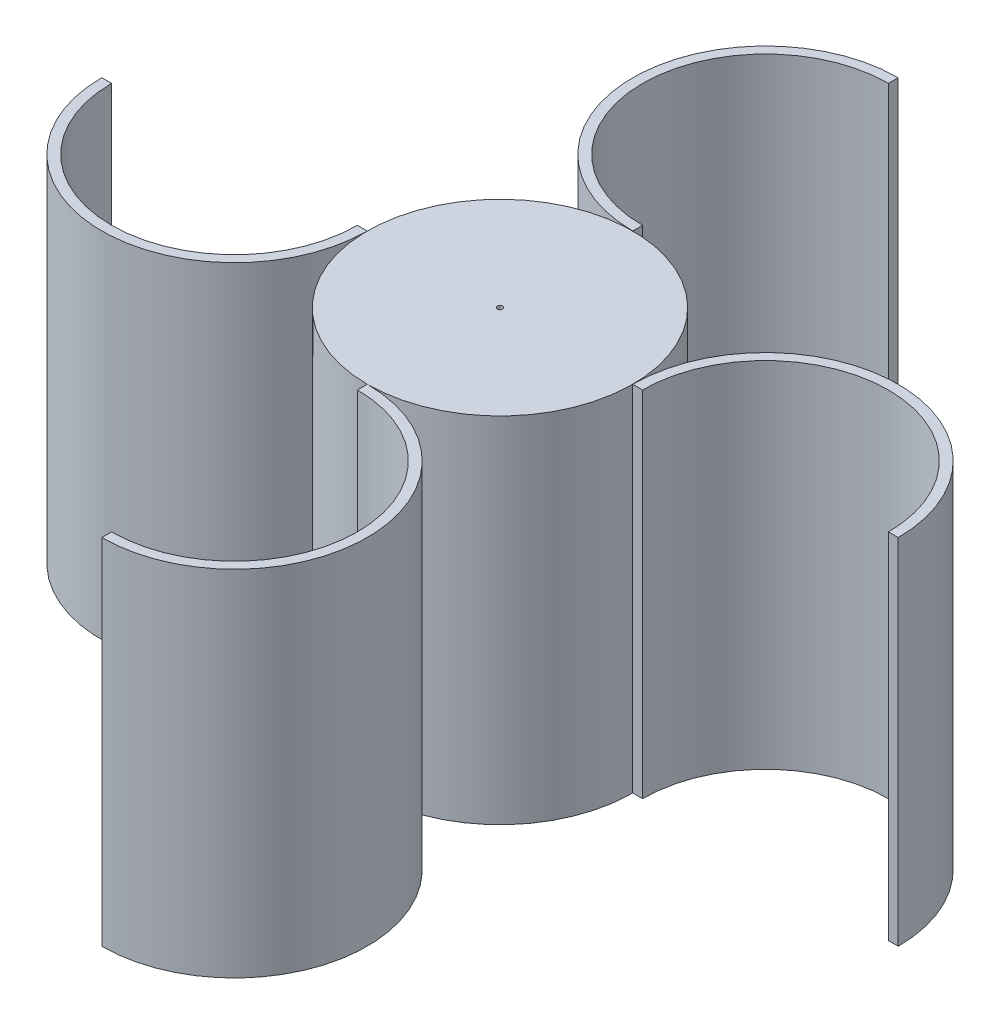
ISO-10303-21;
HEADER;
FILE_DESCRIPTION(('STEP AP214'),'2;1');
FILE_NAME('part.step','',(''),(''),'','','');
FILE_SCHEMA(('AUTOMOTIVE_DESIGN { 1 0 10303 214 1 1 1 1 }'));
ENDSEC;
DATA;
#1=APPLICATION_CONTEXT('core data for automotive mechanical design processes');
#2=APPLICATION_PROTOCOL_DEFINITION('international standard','automotive_design',2000,#1);
#3=PRODUCT_CONTEXT('',#1,'mechanical');
#4=PRODUCT('Part','Part','',(#3));
#5=PRODUCT_RELATED_PRODUCT_CATEGORY('part','',(#4));
#6=PRODUCT_DEFINITION_FORMATION('','',#4);
#7=PRODUCT_DEFINITION_CONTEXT('part definition',#1,'design');
#8=PRODUCT_DEFINITION('design','',#6,#7);
#9=PRODUCT_DEFINITION_SHAPE('','',#8);
#10=(LENGTH_UNIT() NAMED_UNIT(*) SI_UNIT(.MILLI.,.METRE.));
#11=(NAMED_UNIT(*) PLANE_ANGLE_UNIT() SI_UNIT($,.RADIAN.));
#12=(NAMED_UNIT(*) SI_UNIT($,.STERADIAN.) SOLID_ANGLE_UNIT());
#13=UNCERTAINTY_MEASURE_WITH_UNIT(LENGTH_MEASURE(1.E-05),#10,'distance_accuracy_value','');
#14=(GEOMETRIC_REPRESENTATION_CONTEXT(3) GLOBAL_UNCERTAINTY_ASSIGNED_CONTEXT((#13)) GLOBAL_UNIT_ASSIGNED_CONTEXT((#10,
#11,#12)) REPRESENTATION_CONTEXT('',''));
#15=CARTESIAN_POINT('',(0.,0.,0.));
#16=DIRECTION('',(0.,0.,1.));
#17=DIRECTION('',(1.,0.,0.));
#18=AXIS2_PLACEMENT_3D('',#15,#16,#17);
#19=CARTESIAN_POINT('',(15.,0.,0.));
#20=DIRECTION('',(0.,1.,0.));
#21=DIRECTION('',(0.,0.,1.));
#22=AXIS2_PLACEMENT_3D('',#19,#20,#21);
#23=CYLINDRICAL_SURFACE('',#22,6.94582088416006);
#24=CARTESIAN_POINT('',(15.,20.,0.));
#25=DIRECTION('',(0.,1.,0.));
#26=DIRECTION('',(0.,0.,1.));
#27=AXIS2_PLACEMENT_3D('',#24,#25,#26);
#28=CIRCLE('',#27,6.94582088416006);
#29=CARTESIAN_POINT('',(21.9458208841601,20.,0.));
#30=VERTEX_POINT('',#29);
#31=CARTESIAN_POINT('',(8.05417911583994,20.,0.));
#32=VERTEX_POINT('',#31);
#33=EDGE_CURVE('E13',#30,#32,#28,.T.);
#34=ORIENTED_EDGE('',*,*,#33,.T.);
#35=DIRECTION('',(0.,1.,0.));
#36=VECTOR('',#35,1.);
#37=CARTESIAN_POINT('',(8.05417911583994,0.,0.));
#38=LINE('',#37,#36);
#39=CARTESIAN_POINT('',(8.05417911583994,0.,0.));
#40=VERTEX_POINT('',#39);
#41=EDGE_CURVE('E135',#40,#32,#38,.T.);
#42=ORIENTED_EDGE('',*,*,#41,.F.);
#43=CARTESIAN_POINT('',(15.,0.,0.));
#44=DIRECTION('',(0.,1.,0.));
#45=DIRECTION('',(0.,0.,1.));
#46=AXIS2_PLACEMENT_3D('',#43,#44,#45);
#47=CIRCLE('',#46,6.94582088416006);
#48=CARTESIAN_POINT('',(21.9458208841601,0.,0.));
#49=VERTEX_POINT('',#48);
#50=EDGE_CURVE('E77',#49,#40,#47,.T.);
#51=ORIENTED_EDGE('',*,*,#50,.F.);
#52=DIRECTION('',(0.,1.,0.));
#53=VECTOR('',#52,1.);
#54=CARTESIAN_POINT('',(21.9458208841601,0.,0.));
#55=LINE('',#54,#53);
#56=EDGE_CURVE('E144',#49,#30,#55,.T.);
#57=ORIENTED_EDGE('',*,*,#56,.T.);
#58=EDGE_LOOP('',(#34,#42,#51,#57));
#59=FACE_BOUND('',#58,.T.);
#60=ADVANCED_FACE('F79',(#59),#23,.F.);
#61=CARTESIAN_POINT('',(0.,0.,0.));
#62=DIRECTION('',(0.,0.,-1.));
#63=DIRECTION('',(-1.,0.,0.));
#64=AXIS2_PLACEMENT_3D('',#61,#62,#63);
#65=PLANE('',#64);
#66=DIRECTION('',(-1.,0.,0.));
#67=VECTOR('',#66,1.);
#68=CARTESIAN_POINT('',(0.,20.,0.));
#69=LINE('',#68,#67);
#70=CARTESIAN_POINT('',(7.5,20.,0.));
#71=VERTEX_POINT('',#70);
#72=EDGE_CURVE('E123',#32,#71,#69,.T.);
#73=ORIENTED_EDGE('',*,*,#72,.T.);
#74=DIRECTION('',(0.,1.,0.));
#75=VECTOR('',#74,1.);
#76=CARTESIAN_POINT('',(7.5,0.,0.));
#77=LINE('',#76,#75);
#78=CARTESIAN_POINT('',(7.5,0.,0.));
#79=VERTEX_POINT('',#78);
#80=EDGE_CURVE('E126',#79,#71,#77,.T.);
#81=ORIENTED_EDGE('',*,*,#80,.F.);
#82=DIRECTION('',(-1.,0.,0.));
#83=VECTOR('',#82,1.);
#84=CARTESIAN_POINT('',(0.,0.,0.));
#85=LINE('',#84,#83);
#86=EDGE_CURVE('E141',#40,#79,#85,.T.);
#87=ORIENTED_EDGE('',*,*,#86,.F.);
#88=ORIENTED_EDGE('',*,*,#41,.T.);
#89=EDGE_LOOP('',(#73,#81,#87,#88));
#90=FACE_BOUND('',#89,.T.);
#91=ADVANCED_FACE('F132',(#90),#65,.F.);
#92=CARTESIAN_POINT('',(15.,0.,0.));
#93=DIRECTION('',(0.,1.,0.));
#94=DIRECTION('',(0.,0.,1.));
#95=AXIS2_PLACEMENT_3D('',#92,#93,#94);
#96=CYLINDRICAL_SURFACE('',#95,7.5);
#97=CARTESIAN_POINT('',(15.,20.,0.));
#98=DIRECTION('',(0.,1.,0.));
#99=DIRECTION('',(0.,0.,1.));
#100=AXIS2_PLACEMENT_3D('',#97,#98,#99);
#101=CIRCLE('',#100,7.5);
#102=CARTESIAN_POINT('',(22.5,20.,0.));
#103=VERTEX_POINT('',#102);
#104=EDGE_CURVE('E128',#103,#71,#101,.T.);
#105=ORIENTED_EDGE('',*,*,#104,.F.);
#106=DIRECTION('',(0.,1.,0.));
#107=VECTOR('',#106,1.);
#108=CARTESIAN_POINT('',(22.5,0.,0.));
#109=LINE('',#108,#107);
#110=CARTESIAN_POINT('',(22.5,0.,0.));
#111=VERTEX_POINT('',#110);
#112=EDGE_CURVE('E109',#111,#103,#109,.T.);
#113=ORIENTED_EDGE('',*,*,#112,.F.);
#114=CARTESIAN_POINT('',(15.,0.,0.));
#115=DIRECTION('',(0.,1.,0.));
#116=DIRECTION('',(0.,0.,1.));
#117=AXIS2_PLACEMENT_3D('',#114,#115,#116);
#118=CIRCLE('',#117,7.5);
#119=EDGE_CURVE('E134',#111,#79,#118,.T.);
#120=ORIENTED_EDGE('',*,*,#119,.T.);
#121=ORIENTED_EDGE('',*,*,#80,.T.);
#122=EDGE_LOOP('',(#105,#113,#120,#121));
#123=FACE_BOUND('',#122,.T.);
#124=ADVANCED_FACE('F129',(#123),#96,.T.);
#125=CARTESIAN_POINT('',(0.,0.,0.));
#126=DIRECTION('',(0.,0.,-1.));
#127=DIRECTION('',(-1.,0.,0.));
#128=AXIS2_PLACEMENT_3D('',#125,#126,#127);
#129=PLANE('',#128);
#130=DIRECTION('',(-1.,0.,0.));
#131=VECTOR('',#130,1.);
#132=CARTESIAN_POINT('',(0.,20.,0.));
#133=LINE('',#132,#131);
#134=EDGE_CURVE('E88',#103,#30,#133,.T.);
#135=ORIENTED_EDGE('',*,*,#134,.T.);
#136=ORIENTED_EDGE('',*,*,#56,.F.);
#137=DIRECTION('',(-1.,0.,0.));
#138=VECTOR('',#137,1.);
#139=CARTESIAN_POINT('',(0.,0.,0.));
#140=LINE('',#139,#138);
#141=EDGE_CURVE('E116',#111,#49,#140,.T.);
#142=ORIENTED_EDGE('',*,*,#141,.F.);
#143=ORIENTED_EDGE('',*,*,#112,.T.);
#144=EDGE_LOOP('',(#135,#136,#142,#143));
#145=FACE_BOUND('',#144,.T.);
#146=ADVANCED_FACE('F147',(#145),#129,.F.);
#147=CARTESIAN_POINT('',(0.,0.,0.));
#148=DIRECTION('',(0.,1.,0.));
#149=DIRECTION('',(0.,0.,1.));
#150=AXIS2_PLACEMENT_3D('',#147,#148,#149);
#151=PLANE('',#150);
#152=ORIENTED_EDGE('',*,*,#50,.T.);
#153=ORIENTED_EDGE('',*,*,#86,.T.);
#154=ORIENTED_EDGE('',*,*,#119,.F.);
#155=ORIENTED_EDGE('',*,*,#141,.T.);
#156=EDGE_LOOP('',(#152,#153,#154,#155));
#157=FACE_BOUND('',#156,.T.);
#158=ADVANCED_FACE('F80',(#157),#151,.F.);
#159=CARTESIAN_POINT('',(0.,20.,0.));
#160=DIRECTION('',(0.,1.,0.));
#161=DIRECTION('',(0.,0.,1.));
#162=AXIS2_PLACEMENT_3D('',#159,#160,#161);
#163=PLANE('',#162);
#164=ORIENTED_EDGE('',*,*,#33,.F.);
#165=ORIENTED_EDGE('',*,*,#134,.F.);
#166=ORIENTED_EDGE('',*,*,#104,.T.);
#167=ORIENTED_EDGE('',*,*,#72,.F.);
#168=EDGE_LOOP('',(#164,#165,#166,#167));
#169=FACE_BOUND('',#168,.T.);
#170=ADVANCED_FACE('F137',(#169),#163,.T.);
#171=CLOSED_SHELL('',(#60,#91,#124,#146,#158,#170));
#172=MANIFOLD_SOLID_BREP('B2',#171);
#173=CARTESIAN_POINT('',(-1.04744440165294E-13,0.,15.));
#174=DIRECTION('',(0.,1.,0.));
#175=DIRECTION('',(0.,0.,1.));
#176=AXIS2_PLACEMENT_3D('',#173,#174,#175);
#177=CYLINDRICAL_SURFACE('',#176,6.94582088416006);
#178=CARTESIAN_POINT('',(-1.04744440165294E-13,20.,15.));
#179=DIRECTION('',(0.,1.,0.));
#180=DIRECTION('',(0.,0.,1.));
#181=AXIS2_PLACEMENT_3D('',#178,#179,#180);
#182=CIRCLE('',#181,6.94582088416006);
#183=CARTESIAN_POINT('',(-1.53246848165277E-13,20.,21.9458208841601));
#184=VERTEX_POINT('',#183);
#185=CARTESIAN_POINT('',(0.,20.,8.05417911583994));
#186=VERTEX_POINT('',#185);
#187=EDGE_CURVE('E74',#184,#186,#182,.T.);
#188=ORIENTED_EDGE('',*,*,#187,.T.);
#189=DIRECTION('',(0.,1.,0.));
#190=VECTOR('',#189,1.);
#191=CARTESIAN_POINT('',(0.,0.,8.05417911583994));
#192=LINE('',#191,#190);
#193=CARTESIAN_POINT('',(0.,0.,8.05417911583994));
#194=VERTEX_POINT('',#193);
#195=EDGE_CURVE('E272',#194,#186,#192,.T.);
#196=ORIENTED_EDGE('',*,*,#195,.F.);
#197=CARTESIAN_POINT('',(-1.04744440165294E-13,0.,15.));
#198=DIRECTION('',(0.,1.,0.));
#199=DIRECTION('',(0.,0.,1.));
#200=AXIS2_PLACEMENT_3D('',#197,#198,#199);
#201=CIRCLE('',#200,6.94582088416006);
#202=CARTESIAN_POINT('',(-1.53246848165277E-13,0.,21.9458208841601));
#203=VERTEX_POINT('',#202);
#204=EDGE_CURVE('E219',#203,#194,#201,.T.);
#205=ORIENTED_EDGE('',*,*,#204,.F.);
#206=DIRECTION('',(0.,1.,0.));
#207=VECTOR('',#206,1.);
#208=CARTESIAN_POINT('',(-1.53246848165277E-13,0.,21.9458208841601));
#209=LINE('',#208,#207);
#210=EDGE_CURVE('E282',#203,#184,#209,.T.);
#211=ORIENTED_EDGE('',*,*,#210,.T.);
#212=EDGE_LOOP('',(#188,#196,#205,#211));
#213=FACE_BOUND('',#212,.T.);
#214=ADVANCED_FACE('F216',(#213),#177,.F.);
#215=CARTESIAN_POINT('',(0.,0.,0.));
#216=DIRECTION('',(1.,0.,0.));
#217=DIRECTION('',(0.,0.,-1.));
#218=AXIS2_PLACEMENT_3D('',#215,#216,#217);
#219=PLANE('',#218);
#220=DIRECTION('',(0.,0.,-1.));
#221=VECTOR('',#220,1.);
#222=CARTESIAN_POINT('',(0.,20.,0.));
#223=LINE('',#222,#221);
#224=CARTESIAN_POINT('',(0.,20.,7.5));
#225=VERTEX_POINT('',#224);
#226=EDGE_CURVE('E262',#186,#225,#223,.T.);
#227=ORIENTED_EDGE('',*,*,#226,.T.);
#228=DIRECTION('',(0.,1.,0.));
#229=VECTOR('',#228,1.);
#230=CARTESIAN_POINT('',(0.,0.,7.5));
#231=LINE('',#230,#229);
#232=CARTESIAN_POINT('',(0.,0.,7.5));
#233=VERTEX_POINT('',#232);
#234=EDGE_CURVE('E268',#233,#225,#231,.T.);
#235=ORIENTED_EDGE('',*,*,#234,.F.);
#236=DIRECTION('',(0.,0.,-1.));
#237=VECTOR('',#236,1.);
#238=CARTESIAN_POINT('',(0.,0.,0.));
#239=LINE('',#238,#237);
#240=EDGE_CURVE('E285',#194,#233,#239,.T.);
#241=ORIENTED_EDGE('',*,*,#240,.F.);
#242=ORIENTED_EDGE('',*,*,#195,.T.);
#243=EDGE_LOOP('',(#227,#235,#241,#242));
#244=FACE_BOUND('',#243,.T.);
#245=ADVANCED_FACE('F274',(#244),#219,.F.);
#246=CARTESIAN_POINT('',(-1.04744440165294E-13,0.,15.));
#247=DIRECTION('',(0.,1.,0.));
#248=DIRECTION('',(0.,0.,1.));
#249=AXIS2_PLACEMENT_3D('',#246,#247,#248);
#250=CYLINDRICAL_SURFACE('',#249,7.5);
#251=CARTESIAN_POINT('',(-1.04744440165294E-13,20.,15.));
#252=DIRECTION('',(0.,1.,0.));
#253=DIRECTION('',(0.,0.,1.));
#254=AXIS2_PLACEMENT_3D('',#251,#252,#253);
#255=CIRCLE('',#254,7.5);
#256=CARTESIAN_POINT('',(-1.57116660247941E-13,20.,22.5));
#257=VERTEX_POINT('',#256);
#258=EDGE_CURVE('E269',#257,#225,#255,.T.);
#259=ORIENTED_EDGE('',*,*,#258,.F.);
#260=DIRECTION('',(0.,1.,0.));
#261=VECTOR('',#260,1.);
#262=CARTESIAN_POINT('',(-1.57116660247941E-13,0.,22.5));
#263=LINE('',#262,#261);
#264=CARTESIAN_POINT('',(-1.57116660247941E-13,0.,22.5));
#265=VERTEX_POINT('',#264);
#266=EDGE_CURVE('E249',#265,#257,#263,.T.);
#267=ORIENTED_EDGE('',*,*,#266,.F.);
#268=CARTESIAN_POINT('',(-1.04744440165294E-13,0.,15.));
#269=DIRECTION('',(0.,1.,0.));
#270=DIRECTION('',(0.,0.,1.));
#271=AXIS2_PLACEMENT_3D('',#268,#269,#270);
#272=CIRCLE('',#271,7.5);
#273=EDGE_CURVE('E271',#265,#233,#272,.T.);
#274=ORIENTED_EDGE('',*,*,#273,.T.);
#275=ORIENTED_EDGE('',*,*,#234,.T.);
#276=EDGE_LOOP('',(#259,#267,#274,#275));
#277=FACE_BOUND('',#276,.T.);
#278=ADVANCED_FACE('F267',(#277),#250,.T.);
#279=CARTESIAN_POINT('',(0.,0.,0.));
#280=DIRECTION('',(1.,0.,0.));
#281=DIRECTION('',(0.,0.,-1.));
#282=AXIS2_PLACEMENT_3D('',#279,#280,#281);
#283=PLANE('',#282);
#284=DIRECTION('',(0.,0.,-1.));
#285=VECTOR('',#284,1.);
#286=CARTESIAN_POINT('',(0.,20.,0.));
#287=LINE('',#286,#285);
#288=EDGE_CURVE('E229',#257,#184,#287,.T.);
#289=ORIENTED_EDGE('',*,*,#288,.T.);
#290=ORIENTED_EDGE('',*,*,#210,.F.);
#291=DIRECTION('',(0.,0.,-1.));
#292=VECTOR('',#291,1.);
#293=CARTESIAN_POINT('',(0.,0.,0.));
#294=LINE('',#293,#292);
#295=EDGE_CURVE('E260',#265,#203,#294,.T.);
#296=ORIENTED_EDGE('',*,*,#295,.F.);
#297=ORIENTED_EDGE('',*,*,#266,.T.);
#298=EDGE_LOOP('',(#289,#290,#296,#297));
#299=FACE_BOUND('',#298,.T.);
#300=ADVANCED_FACE('F289',(#299),#283,.F.);
#301=CARTESIAN_POINT('',(0.,0.,0.));
#302=DIRECTION('',(0.,1.,0.));
#303=DIRECTION('',(0.,0.,1.));
#304=AXIS2_PLACEMENT_3D('',#301,#302,#303);
#305=PLANE('',#304);
#306=ORIENTED_EDGE('',*,*,#204,.T.);
#307=ORIENTED_EDGE('',*,*,#240,.T.);
#308=ORIENTED_EDGE('',*,*,#273,.F.);
#309=ORIENTED_EDGE('',*,*,#295,.T.);
#310=EDGE_LOOP('',(#306,#307,#308,#309));
#311=FACE_BOUND('',#310,.T.);
#312=ADVANCED_FACE('F217',(#311),#305,.F.);
#313=CARTESIAN_POINT('',(0.,20.,0.));
#314=DIRECTION('',(0.,1.,0.));
#315=DIRECTION('',(0.,0.,1.));
#316=AXIS2_PLACEMENT_3D('',#313,#314,#315);
#317=PLANE('',#316);
#318=ORIENTED_EDGE('',*,*,#187,.F.);
#319=ORIENTED_EDGE('',*,*,#288,.F.);
#320=ORIENTED_EDGE('',*,*,#258,.T.);
#321=ORIENTED_EDGE('',*,*,#226,.F.);
#322=EDGE_LOOP('',(#318,#319,#320,#321));
#323=FACE_BOUND('',#322,.T.);
#324=ADVANCED_FACE('F279',(#323),#317,.T.);
#325=CLOSED_SHELL('',(#214,#245,#278,#300,#312,#324));
#326=MANIFOLD_SOLID_BREP('B7',#325);
#327=CARTESIAN_POINT('',(0.,20.,0.));
#328=DIRECTION('',(0.,1.,0.));
#329=DIRECTION('',(0.,0.,1.));
#330=AXIS2_PLACEMENT_3D('',#327,#328,#329);
#331=PLANE('',#330);
#332=CARTESIAN_POINT('',(-15.,20.,-1.57116660247941E-13));
#333=DIRECTION('',(0.,1.,0.));
#334=DIRECTION('',(0.,0.,1.));
#335=AXIS2_PLACEMENT_3D('',#332,#333,#334);
#336=CIRCLE('',#335,6.94582088416006);
#337=CARTESIAN_POINT('',(-21.9458208841601,20.,-2.29870272247916E-13));
#338=VERTEX_POINT('',#337);
#339=CARTESIAN_POINT('',(-8.05417911583994,20.,0.));
#340=VERTEX_POINT('',#339);
#341=EDGE_CURVE('E212',#338,#340,#336,.T.);
#342=ORIENTED_EDGE('',*,*,#341,.F.);
#343=DIRECTION('',(1.,0.,0.));
#344=VECTOR('',#343,1.);
#345=CARTESIAN_POINT('',(0.,20.,0.));
#346=LINE('',#345,#344);
#347=CARTESIAN_POINT('',(-22.5,20.,-2.35674990371912E-13));
#348=VERTEX_POINT('',#347);
#349=EDGE_CURVE('E368',#348,#338,#346,.T.);
#350=ORIENTED_EDGE('',*,*,#349,.F.);
#351=CARTESIAN_POINT('',(-15.,20.,-1.57116660247941E-13));
#352=DIRECTION('',(0.,1.,0.));
#353=DIRECTION('',(0.,0.,1.));
#354=AXIS2_PLACEMENT_3D('',#351,#352,#353);
#355=CIRCLE('',#354,7.5);
#356=CARTESIAN_POINT('',(-7.5,20.,0.));
#357=VERTEX_POINT('',#356);
#358=EDGE_CURVE('E407',#348,#357,#355,.T.);
#359=ORIENTED_EDGE('',*,*,#358,.T.);
#360=DIRECTION('',(1.,0.,0.));
#361=VECTOR('',#360,1.);
#362=CARTESIAN_POINT('',(0.,20.,0.));
#363=LINE('',#362,#361);
#364=EDGE_CURVE('E404',#340,#357,#363,.T.);
#365=ORIENTED_EDGE('',*,*,#364,.F.);
#366=EDGE_LOOP('',(#342,#350,#359,#365));
#367=FACE_BOUND('',#366,.T.);
#368=ADVANCED_FACE('F356',(#367),#331,.T.);
#369=CARTESIAN_POINT('',(0.,0.,0.));
#370=DIRECTION('',(0.,0.,1.));
#371=DIRECTION('',(1.,0.,0.));
#372=AXIS2_PLACEMENT_3D('',#369,#370,#371);
#373=PLANE('',#372);
#374=ORIENTED_EDGE('',*,*,#364,.T.);
#375=DIRECTION('',(0.,1.,0.));
#376=VECTOR('',#375,1.);
#377=CARTESIAN_POINT('',(-7.5,0.,0.));
#378=LINE('',#377,#376);
#379=CARTESIAN_POINT('',(-7.5,0.,0.));
#380=VERTEX_POINT('',#379);
#381=EDGE_CURVE('E410',#380,#357,#378,.T.);
#382=ORIENTED_EDGE('',*,*,#381,.F.);
#383=DIRECTION('',(1.,0.,0.));
#384=VECTOR('',#383,1.);
#385=CARTESIAN_POINT('',(0.,0.,0.));
#386=LINE('',#385,#384);
#387=CARTESIAN_POINT('',(-8.05417911583994,0.,0.));
#388=VERTEX_POINT('',#387);
#389=EDGE_CURVE('E425',#388,#380,#386,.T.);
#390=ORIENTED_EDGE('',*,*,#389,.F.);
#391=DIRECTION('',(0.,1.,0.));
#392=VECTOR('',#391,1.);
#393=CARTESIAN_POINT('',(-8.05417911583994,0.,0.));
#394=LINE('',#393,#392);
#395=EDGE_CURVE('E412',#388,#340,#394,.T.);
#396=ORIENTED_EDGE('',*,*,#395,.T.);
#397=EDGE_LOOP('',(#374,#382,#390,#396));
#398=FACE_BOUND('',#397,.T.);
#399=ADVANCED_FACE('F414',(#398),#373,.F.);
#400=CARTESIAN_POINT('',(-15.,0.,-1.57116660247941E-13));
#401=DIRECTION('',(0.,1.,0.));
#402=DIRECTION('',(0.,0.,1.));
#403=AXIS2_PLACEMENT_3D('',#400,#401,#402);
#404=CYLINDRICAL_SURFACE('',#403,7.5);
#405=ORIENTED_EDGE('',*,*,#358,.F.);
#406=DIRECTION('',(0.,1.,0.));
#407=VECTOR('',#406,1.);
#408=CARTESIAN_POINT('',(-22.5,0.,-2.35674990371912E-13));
#409=LINE('',#408,#407);
#410=CARTESIAN_POINT('',(-22.5,0.,-2.35674990371912E-13));
#411=VERTEX_POINT('',#410);
#412=EDGE_CURVE('E388',#411,#348,#409,.T.);
#413=ORIENTED_EDGE('',*,*,#412,.F.);
#414=CARTESIAN_POINT('',(-15.,0.,-1.57116660247941E-13));
#415=DIRECTION('',(0.,1.,0.));
#416=DIRECTION('',(0.,0.,1.));
#417=AXIS2_PLACEMENT_3D('',#414,#415,#416);
#418=CIRCLE('',#417,7.5);
#419=EDGE_CURVE('E411',#411,#380,#418,.T.);
#420=ORIENTED_EDGE('',*,*,#419,.T.);
#421=ORIENTED_EDGE('',*,*,#381,.T.);
#422=EDGE_LOOP('',(#405,#413,#420,#421));
#423=FACE_BOUND('',#422,.T.);
#424=ADVANCED_FACE('F408',(#423),#404,.T.);
#425=CARTESIAN_POINT('',(0.,0.,0.));
#426=DIRECTION('',(0.,0.,1.));
#427=DIRECTION('',(1.,0.,0.));
#428=AXIS2_PLACEMENT_3D('',#425,#426,#427);
#429=PLANE('',#428);
#430=ORIENTED_EDGE('',*,*,#349,.T.);
#431=DIRECTION('',(0.,1.,0.));
#432=VECTOR('',#431,1.);
#433=CARTESIAN_POINT('',(-21.9458208841601,0.,-2.29870272247916E-13));
#434=LINE('',#433,#432);
#435=CARTESIAN_POINT('',(-21.9458208841601,0.,-2.29870272247916E-13));
#436=VERTEX_POINT('',#435);
#437=EDGE_CURVE('E424',#436,#338,#434,.T.);
#438=ORIENTED_EDGE('',*,*,#437,.F.);
#439=DIRECTION('',(1.,0.,0.));
#440=VECTOR('',#439,1.);
#441=CARTESIAN_POINT('',(0.,0.,0.));
#442=LINE('',#441,#440);
#443=EDGE_CURVE('E400',#411,#436,#442,.T.);
#444=ORIENTED_EDGE('',*,*,#443,.F.);
#445=ORIENTED_EDGE('',*,*,#412,.T.);
#446=EDGE_LOOP('',(#430,#438,#444,#445));
#447=FACE_BOUND('',#446,.T.);
#448=ADVANCED_FACE('F429',(#447),#429,.F.);
#449=CARTESIAN_POINT('',(-15.,0.,-1.57116660247941E-13));
#450=DIRECTION('',(0.,1.,0.));
#451=DIRECTION('',(0.,0.,1.));
#452=AXIS2_PLACEMENT_3D('',#449,#450,#451);
#453=CYLINDRICAL_SURFACE('',#452,6.94582088416006);
#454=ORIENTED_EDGE('',*,*,#341,.T.);
#455=ORIENTED_EDGE('',*,*,#395,.F.);
#456=CARTESIAN_POINT('',(-15.,0.,-1.57116660247941E-13));
#457=DIRECTION('',(0.,1.,0.));
#458=DIRECTION('',(0.,0.,1.));
#459=AXIS2_PLACEMENT_3D('',#456,#457,#458);
#460=CIRCLE('',#459,6.94582088416006);
#461=EDGE_CURVE('E359',#436,#388,#460,.T.);
#462=ORIENTED_EDGE('',*,*,#461,.F.);
#463=ORIENTED_EDGE('',*,*,#437,.T.);
#464=EDGE_LOOP('',(#454,#455,#462,#463));
#465=FACE_BOUND('',#464,.T.);
#466=ADVANCED_FACE('F430',(#465),#453,.F.);
#467=CARTESIAN_POINT('',(0.,0.,0.));
#468=DIRECTION('',(0.,1.,0.));
#469=DIRECTION('',(0.,0.,1.));
#470=AXIS2_PLACEMENT_3D('',#467,#468,#469);
#471=PLANE('',#470);
#472=ORIENTED_EDGE('',*,*,#461,.T.);
#473=ORIENTED_EDGE('',*,*,#389,.T.);
#474=ORIENTED_EDGE('',*,*,#419,.F.);
#475=ORIENTED_EDGE('',*,*,#443,.T.);
#476=EDGE_LOOP('',(#472,#473,#474,#475));
#477=FACE_BOUND('',#476,.T.);
#478=ADVANCED_FACE('F357',(#477),#471,.F.);
#479=CLOSED_SHELL('',(#368,#399,#424,#448,#466,#478));
#480=MANIFOLD_SOLID_BREP('B67',#479);
#481=CARTESIAN_POINT('',(0.,0.,-15.));
#482=DIRECTION('',(0.,1.,0.));
#483=DIRECTION('',(0.,0.,1.));
#484=AXIS2_PLACEMENT_3D('',#481,#482,#483);
#485=CYLINDRICAL_SURFACE('',#484,6.94582088416006);
#486=CARTESIAN_POINT('',(0.,20.,-15.));
#487=DIRECTION('',(0.,1.,0.));
#488=DIRECTION('',(0.,0.,1.));
#489=AXIS2_PLACEMENT_3D('',#486,#487,#488);
#490=CIRCLE('',#489,6.94582088416006);
#491=CARTESIAN_POINT('',(0.,20.,-21.9458208841601));
#492=VERTEX_POINT('',#491);
#493=CARTESIAN_POINT('',(0.,20.,-8.05417911583994));
#494=VERTEX_POINT('',#493);
#495=EDGE_CURVE('E572',#492,#494,#490,.T.);
#496=ORIENTED_EDGE('',*,*,#495,.T.);
#497=DIRECTION('',(0.,1.,0.));
#498=VECTOR('',#497,1.);
#499=CARTESIAN_POINT('',(0.,0.,-8.05417911583994));
#500=LINE('',#499,#498);
#501=CARTESIAN_POINT('',(0.,0.,-8.05417911583994));
#502=VERTEX_POINT('',#501);
#503=EDGE_CURVE('E353',#502,#494,#500,.T.);
#504=ORIENTED_EDGE('',*,*,#503,.F.);
#505=CARTESIAN_POINT('',(0.,0.,-15.));
#506=DIRECTION('',(0.,1.,0.));
#507=DIRECTION('',(0.,0.,1.));
#508=AXIS2_PLACEMENT_3D('',#505,#506,#507);
#509=CIRCLE('',#508,6.94582088416006);
#510=CARTESIAN_POINT('',(0.,0.,-21.9458208841601));
#511=VERTEX_POINT('',#510);
#512=EDGE_CURVE('E566',#511,#502,#509,.T.);
#513=ORIENTED_EDGE('',*,*,#512,.F.);
#514=DIRECTION('',(0.,1.,0.));
#515=VECTOR('',#514,1.);
#516=CARTESIAN_POINT('',(0.,0.,-21.9458208841601));
#517=LINE('',#516,#515);
#518=EDGE_CURVE('E514',#511,#492,#517,.T.);
#519=ORIENTED_EDGE('',*,*,#518,.T.);
#520=EDGE_LOOP('',(#496,#504,#513,#519));
#521=FACE_BOUND('',#520,.T.);
#522=ADVANCED_FACE('F512',(#521),#485,.F.);
#523=CARTESIAN_POINT('',(0.,0.,0.));
#524=DIRECTION('',(-1.,0.,0.));
#525=DIRECTION('',(0.,0.,1.));
#526=AXIS2_PLACEMENT_3D('',#523,#524,#525);
#527=PLANE('',#526);
#528=DIRECTION('',(0.,0.,1.));
#529=VECTOR('',#528,1.);
#530=CARTESIAN_POINT('',(0.,20.,0.));
#531=LINE('',#530,#529);
#532=CARTESIAN_POINT('',(0.,20.,-7.5));
#533=VERTEX_POINT('',#532);
#534=EDGE_CURVE('E549',#494,#533,#531,.T.);
#535=ORIENTED_EDGE('',*,*,#534,.T.);
#536=DIRECTION('',(0.,1.,0.));
#537=VECTOR('',#536,1.);
#538=CARTESIAN_POINT('',(0.,0.,-7.5));
#539=LINE('',#538,#537);
#540=CARTESIAN_POINT('',(0.,0.,-7.5));
#541=VERTEX_POINT('',#540);
#542=EDGE_CURVE('E517',#541,#533,#539,.T.);
#543=ORIENTED_EDGE('',*,*,#542,.F.);
#544=DIRECTION('',(0.,0.,1.));
#545=VECTOR('',#544,1.);
#546=CARTESIAN_POINT('',(0.,0.,0.));
#547=LINE('',#546,#545);
#548=EDGE_CURVE('E526',#502,#541,#547,.T.);
#549=ORIENTED_EDGE('',*,*,#548,.F.);
#550=ORIENTED_EDGE('',*,*,#503,.T.);
#551=EDGE_LOOP('',(#535,#543,#549,#550));
#552=FACE_BOUND('',#551,.T.);
#553=ADVANCED_FACE('F585',(#552),#527,.F.);
#554=CARTESIAN_POINT('',(0.,0.,-15.));
#555=DIRECTION('',(0.,1.,0.));
#556=DIRECTION('',(0.,0.,1.));
#557=AXIS2_PLACEMENT_3D('',#554,#555,#556);
#558=CYLINDRICAL_SURFACE('',#557,7.5);
#559=CARTESIAN_POINT('',(0.,20.,-15.));
#560=DIRECTION('',(0.,1.,0.));
#561=DIRECTION('',(0.,0.,1.));
#562=AXIS2_PLACEMENT_3D('',#559,#560,#561);
#563=CIRCLE('',#562,7.5);
#564=CARTESIAN_POINT('',(0.,20.,-22.5));
#565=VERTEX_POINT('',#564);
#566=EDGE_CURVE('E565',#565,#533,#563,.T.);
#567=ORIENTED_EDGE('',*,*,#566,.F.);
#568=DIRECTION('',(0.,1.,0.));
#569=VECTOR('',#568,1.);
#570=CARTESIAN_POINT('',(0.,0.,-22.5));
#571=LINE('',#570,#569);
#572=CARTESIAN_POINT('',(0.,0.,-22.5));
#573=VERTEX_POINT('',#572);
#574=EDGE_CURVE('E558',#573,#565,#571,.T.);
#575=ORIENTED_EDGE('',*,*,#574,.F.);
#576=CARTESIAN_POINT('',(0.,0.,-15.));
#577=DIRECTION('',(0.,1.,0.));
#578=DIRECTION('',(0.,0.,1.));
#579=AXIS2_PLACEMENT_3D('',#576,#577,#578);
#580=CIRCLE('',#579,7.5);
#581=EDGE_CURVE('E561',#573,#541,#580,.T.);
#582=ORIENTED_EDGE('',*,*,#581,.T.);
#583=ORIENTED_EDGE('',*,*,#542,.T.);
#584=EDGE_LOOP('',(#567,#575,#582,#583));
#585=FACE_BOUND('',#584,.T.);
#586=ADVANCED_FACE('F557',(#585),#558,.T.);
#587=CARTESIAN_POINT('',(0.,0.,0.));
#588=DIRECTION('',(-1.,0.,0.));
#589=DIRECTION('',(0.,0.,1.));
#590=AXIS2_PLACEMENT_3D('',#587,#588,#589);
#591=PLANE('',#590);
#592=DIRECTION('',(0.,0.,1.));
#593=VECTOR('',#592,1.);
#594=CARTESIAN_POINT('',(0.,20.,0.));
#595=LINE('',#594,#593);
#596=EDGE_CURVE('E577',#565,#492,#595,.T.);
#597=ORIENTED_EDGE('',*,*,#596,.T.);
#598=ORIENTED_EDGE('',*,*,#518,.F.);
#599=DIRECTION('',(0.,0.,1.));
#600=VECTOR('',#599,1.);
#601=CARTESIAN_POINT('',(0.,0.,0.));
#602=LINE('',#601,#600);
#603=EDGE_CURVE('E559',#573,#511,#602,.T.);
#604=ORIENTED_EDGE('',*,*,#603,.F.);
#605=ORIENTED_EDGE('',*,*,#574,.T.);
#606=EDGE_LOOP('',(#597,#598,#604,#605));
#607=FACE_BOUND('',#606,.T.);
#608=ADVANCED_FACE('F564',(#607),#591,.F.);
#609=CARTESIAN_POINT('',(0.,0.,0.));
#610=DIRECTION('',(0.,1.,0.));
#611=DIRECTION('',(0.,0.,1.));
#612=AXIS2_PLACEMENT_3D('',#609,#610,#611);
#613=PLANE('',#612);
#614=ORIENTED_EDGE('',*,*,#512,.T.);
#615=ORIENTED_EDGE('',*,*,#548,.T.);
#616=ORIENTED_EDGE('',*,*,#581,.F.);
#617=ORIENTED_EDGE('',*,*,#603,.T.);
#618=EDGE_LOOP('',(#614,#615,#616,#617));
#619=FACE_BOUND('',#618,.T.);
#620=ADVANCED_FACE('F568',(#619),#613,.F.);
#621=CARTESIAN_POINT('',(0.,20.,0.));
#622=DIRECTION('',(0.,1.,0.));
#623=DIRECTION('',(0.,0.,1.));
#624=AXIS2_PLACEMENT_3D('',#621,#622,#623);
#625=PLANE('',#624);
#626=ORIENTED_EDGE('',*,*,#495,.F.);
#627=ORIENTED_EDGE('',*,*,#596,.F.);
#628=ORIENTED_EDGE('',*,*,#566,.T.);
#629=ORIENTED_EDGE('',*,*,#534,.F.);
#630=EDGE_LOOP('',(#626,#627,#628,#629));
#631=FACE_BOUND('',#630,.T.);
#632=ADVANCED_FACE('F593',(#631),#625,.T.);
#633=CLOSED_SHELL('',(#522,#553,#586,#608,#620,#632));
#634=MANIFOLD_SOLID_BREP('B208',#633);
#635=CARTESIAN_POINT('',(0.,20.,0.));
#636=DIRECTION('',(0.,-1.,0.));
#637=DIRECTION('',(0.,0.,-1.));
#638=AXIS2_PLACEMENT_3D('',#635,#636,#637);
#639=CYLINDRICAL_SURFACE('',#638,7.5);
#640=CARTESIAN_POINT('',(0.,20.,0.));
#641=DIRECTION('',(0.,1.,0.));
#642=DIRECTION('',(0.,0.,1.));
#643=AXIS2_PLACEMENT_3D('',#640,#641,#642);
#644=CIRCLE('',#643,7.5);
#645=CARTESIAN_POINT('',(0.,20.,7.5));
#646=VERTEX_POINT('',#645);
#647=EDGE_CURVE('E509',#646,#646,#644,.T.);
#648=ORIENTED_EDGE('',*,*,#647,.F.);
#649=EDGE_LOOP('',(#648));
#650=FACE_BOUND('',#649,.T.);
#651=CARTESIAN_POINT('',(0.,0.,0.));
#652=DIRECTION('',(0.,1.,0.));
#653=DIRECTION('',(0.,0.,1.));
#654=AXIS2_PLACEMENT_3D('',#651,#652,#653);
#655=CIRCLE('',#654,7.5);
#656=CARTESIAN_POINT('',(0.,0.,7.5));
#657=VERTEX_POINT('',#656);
#658=EDGE_CURVE('E644',#657,#657,#655,.T.);
#659=ORIENTED_EDGE('',*,*,#658,.T.);
#660=EDGE_LOOP('',(#659));
#661=FACE_BOUND('',#660,.T.);
#662=ADVANCED_FACE('F643',(#650,#661),#639,.T.);
#663=CARTESIAN_POINT('',(0.,20.,0.));
#664=DIRECTION('',(0.,1.,0.));
#665=DIRECTION('',(0.,0.,1.));
#666=AXIS2_PLACEMENT_3D('',#663,#664,#665);
#667=PLANE('',#666);
#668=CARTESIAN_POINT('',(0.,20.,0.));
#669=DIRECTION('',(0.,-1.,0.));
#670=DIRECTION('',(0.,0.,-1.));
#671=AXIS2_PLACEMENT_3D('',#668,#669,#670);
#672=CIRCLE('',#671,0.15);
#673=CARTESIAN_POINT('',(0.,20.,-0.15));
#674=VERTEX_POINT('',#673);
#675=EDGE_CURVE('E651',#674,#674,#672,.T.);
#676=ORIENTED_EDGE('',*,*,#675,.T.);
#677=EDGE_LOOP('',(#676));
#678=FACE_BOUND('',#677,.T.);
#679=ORIENTED_EDGE('',*,*,#647,.T.);
#680=EDGE_LOOP('',(#679));
#681=FACE_BOUND('',#680,.T.);
#682=ADVANCED_FACE('F658',(#678,#681),#667,.T.);
#683=CARTESIAN_POINT('',(0.,0.,0.));
#684=DIRECTION('',(0.,1.,0.));
#685=DIRECTION('',(0.,0.,1.));
#686=AXIS2_PLACEMENT_3D('',#683,#684,#685);
#687=PLANE('',#686);
#688=CARTESIAN_POINT('',(0.,0.,0.));
#689=DIRECTION('',(0.,-1.,0.));
#690=DIRECTION('',(0.,0.,-1.));
#691=AXIS2_PLACEMENT_3D('',#688,#689,#690);
#692=CIRCLE('',#691,0.15);
#693=CARTESIAN_POINT('',(0.,0.,-0.15));
#694=VERTEX_POINT('',#693);
#695=EDGE_CURVE('E653',#694,#694,#692,.T.);
#696=ORIENTED_EDGE('',*,*,#695,.F.);
#697=EDGE_LOOP('',(#696));
#698=FACE_BOUND('',#697,.T.);
#699=ORIENTED_EDGE('',*,*,#658,.F.);
#700=EDGE_LOOP('',(#699));
#701=FACE_BOUND('',#700,.T.);
#702=ADVANCED_FACE('F661',(#698,#701),#687,.F.);
#703=CARTESIAN_POINT('',(0.,20.,0.));
#704=DIRECTION('',(0.,-1.,0.));
#705=DIRECTION('',(0.,0.,-1.));
#706=AXIS2_PLACEMENT_3D('',#703,#704,#705);
#707=CYLINDRICAL_SURFACE('',#706,0.15);
#708=ORIENTED_EDGE('',*,*,#675,.F.);
#709=EDGE_LOOP('',(#708));
#710=FACE_BOUND('',#709,.T.);
#711=ORIENTED_EDGE('',*,*,#695,.T.);
#712=EDGE_LOOP('',(#711));
#713=FACE_BOUND('',#712,.T.);
#714=ADVANCED_FACE('F662',(#710,#713),#707,.F.);
#715=CLOSED_SHELL('',(#662,#682,#702,#714));
#716=MANIFOLD_SOLID_BREP('B346',#715);
#717=ADVANCED_BREP_SHAPE_REPRESENTATION('',(#18,#172,#326,#480,#634,#716),#14);
#718=SHAPE_DEFINITION_REPRESENTATION(#9,#717);
ENDSEC;
END-ISO-10303-21;
